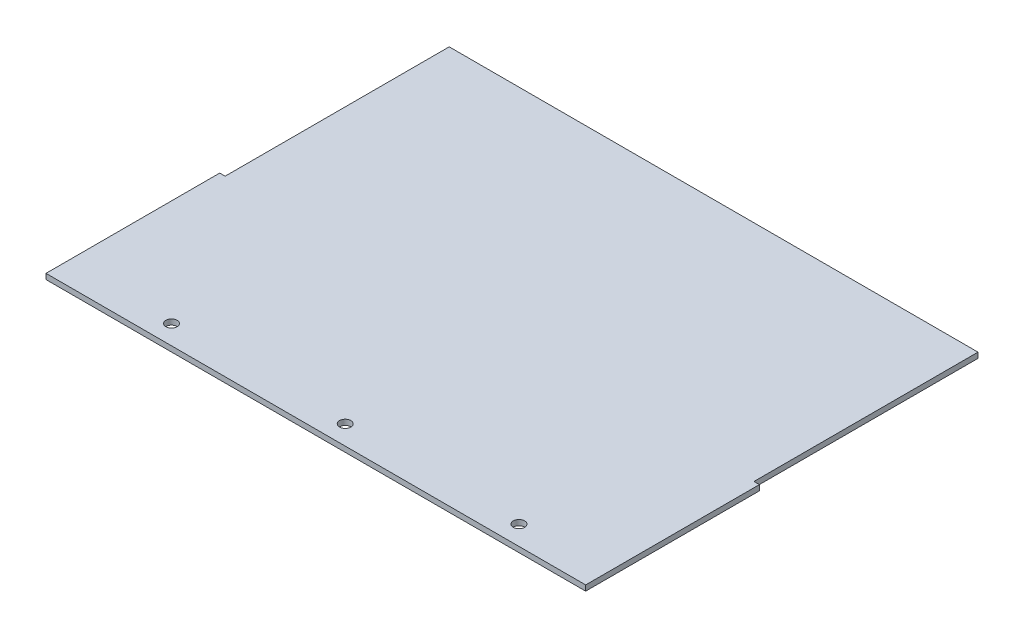
ISO-10303-21;
HEADER;
FILE_DESCRIPTION(('STEP AP214'),'2;1');
FILE_NAME('part.step','',(''),(''),'','','');
FILE_SCHEMA(('AUTOMOTIVE_DESIGN { 1 0 10303 214 1 1 1 1 }'));
ENDSEC;
DATA;
#1=APPLICATION_CONTEXT('core data for automotive mechanical design processes');
#2=APPLICATION_PROTOCOL_DEFINITION('international standard','automotive_design',2000,#1);
#3=PRODUCT_CONTEXT('',#1,'mechanical');
#4=PRODUCT('Part','Part','',(#3));
#5=PRODUCT_RELATED_PRODUCT_CATEGORY('part','',(#4));
#6=PRODUCT_DEFINITION_FORMATION('','',#4);
#7=PRODUCT_DEFINITION_CONTEXT('part definition',#1,'design');
#8=PRODUCT_DEFINITION('design','',#6,#7);
#9=PRODUCT_DEFINITION_SHAPE('','',#8);
#10=(LENGTH_UNIT() NAMED_UNIT(*) SI_UNIT(.MILLI.,.METRE.));
#11=(NAMED_UNIT(*) PLANE_ANGLE_UNIT() SI_UNIT($,.RADIAN.));
#12=(NAMED_UNIT(*) SI_UNIT($,.STERADIAN.) SOLID_ANGLE_UNIT());
#13=UNCERTAINTY_MEASURE_WITH_UNIT(LENGTH_MEASURE(1.E-05),#10,'distance_accuracy_value','');
#14=(GEOMETRIC_REPRESENTATION_CONTEXT(3) GLOBAL_UNCERTAINTY_ASSIGNED_CONTEXT((#13)) GLOBAL_UNIT_ASSIGNED_CONTEXT((#10,
#11,#12)) REPRESENTATION_CONTEXT('',''));
#15=CARTESIAN_POINT('',(0.,0.,0.));
#16=DIRECTION('',(0.,0.,1.));
#17=DIRECTION('',(1.,0.,0.));
#18=AXIS2_PLACEMENT_3D('',#15,#16,#17);
#19=CARTESIAN_POINT('',(-95.7046067812089,1.5875,221.308349999902));
#20=DIRECTION('',(0.,-1.,0.));
#21=DIRECTION('',(0.,0.,-1.));
#22=AXIS2_PLACEMENT_3D('',#19,#20,#21);
#23=CYLINDRICAL_SURFACE('',#22,3.302);
#24=CARTESIAN_POINT('',(-95.7046067812089,1.5875,221.308349999902));
#25=DIRECTION('',(0.,-1.,0.));
#26=DIRECTION('',(0.,0.,-1.));
#27=AXIS2_PLACEMENT_3D('',#24,#25,#26);
#28=CIRCLE('',#27,3.302);
#29=CARTESIAN_POINT('',(-95.7046067812089,1.5875,218.006349999902));
#30=VERTEX_POINT('',#29);
#31=EDGE_CURVE('E47',#30,#30,#28,.T.);
#32=ORIENTED_EDGE('',*,*,#31,.F.);
#33=EDGE_LOOP('',(#32));
#34=FACE_BOUND('',#33,.T.);
#35=CARTESIAN_POINT('',(-95.7046067812089,-1.5875,221.308349999902));
#36=DIRECTION('',(0.,-1.,0.));
#37=DIRECTION('',(0.,0.,-1.));
#38=AXIS2_PLACEMENT_3D('',#35,#36,#37);
#39=CIRCLE('',#38,3.302);
#40=CARTESIAN_POINT('',(-95.7046067812089,-1.5875,218.006349999902));
#41=VERTEX_POINT('',#40);
#42=EDGE_CURVE('E11',#41,#41,#39,.T.);
#43=ORIENTED_EDGE('',*,*,#42,.T.);
#44=EDGE_LOOP('',(#43));
#45=FACE_BOUND('',#44,.T.);
#46=ADVANCED_FACE('F40',(#34,#45),#23,.F.);
#47=CARTESIAN_POINT('',(157.79,-1.5875,232.600000128));
#48=DIRECTION('',(-1.,0.,0.));
#49=DIRECTION('',(0.,0.,1.));
#50=AXIS2_PLACEMENT_3D('',#47,#48,#49);
#51=PLANE('',#50);
#52=DIRECTION('',(0.,1.,0.));
#53=VECTOR('',#52,1.);
#54=CARTESIAN_POINT('',(157.79,-1.5875,130.999992));
#55=LINE('',#54,#53);
#56=CARTESIAN_POINT('',(157.79,-1.5875,130.999992));
#57=VERTEX_POINT('',#56);
#58=CARTESIAN_POINT('',(157.79,1.5875,130.999992));
#59=VERTEX_POINT('',#58);
#60=EDGE_CURVE('E112',#57,#59,#55,.T.);
#61=ORIENTED_EDGE('',*,*,#60,.T.);
#62=DIRECTION('',(0.,0.,-1.));
#63=VECTOR('',#62,1.);
#64=CARTESIAN_POINT('',(157.79,1.5875,232.600000128));
#65=LINE('',#64,#63);
#66=CARTESIAN_POINT('',(157.79,1.5875,232.600000128));
#67=VERTEX_POINT('',#66);
#68=EDGE_CURVE('E176',#67,#59,#65,.T.);
#69=ORIENTED_EDGE('',*,*,#68,.F.);
#70=DIRECTION('',(0.,1.,0.));
#71=VECTOR('',#70,1.);
#72=CARTESIAN_POINT('',(157.79,-1.5875,232.600000128));
#73=LINE('',#72,#71);
#74=CARTESIAN_POINT('',(157.79,-1.5875,232.600000128));
#75=VERTEX_POINT('',#74);
#76=EDGE_CURVE('E157',#75,#67,#73,.T.);
#77=ORIENTED_EDGE('',*,*,#76,.F.);
#78=DIRECTION('',(0.,0.,-1.));
#79=VECTOR('',#78,1.);
#80=CARTESIAN_POINT('',(157.79,-1.5875,232.600000128));
#81=LINE('',#80,#79);
#82=EDGE_CURVE('E166',#75,#57,#81,.T.);
#83=ORIENTED_EDGE('',*,*,#82,.T.);
#84=EDGE_LOOP('',(#61,#69,#77,#83));
#85=FACE_BOUND('',#84,.T.);
#86=ADVANCED_FACE('F185',(#85),#51,.F.);
#87=CARTESIAN_POINT('',(-157.79,1.5875,232.600000128));
#88=DIRECTION('',(0.,-1.,0.));
#89=DIRECTION('',(0.,0.,-1.));
#90=AXIS2_PLACEMENT_3D('',#87,#88,#89);
#91=PLANE('',#90);
#92=CARTESIAN_POINT('',(5.89539321879114,1.5875,221.308349999902));
#93=DIRECTION('',(0.,-1.,0.));
#94=DIRECTION('',(0.,0.,-1.));
#95=AXIS2_PLACEMENT_3D('',#92,#93,#94);
#96=CIRCLE('',#95,3.302);
#97=CARTESIAN_POINT('',(5.89539321879114,1.5875,218.006349999902));
#98=VERTEX_POINT('',#97);
#99=EDGE_CURVE('E326',#98,#98,#96,.T.);
#100=ORIENTED_EDGE('',*,*,#99,.T.);
#101=EDGE_LOOP('',(#100));
#102=FACE_BOUND('',#101,.T.);
#103=CARTESIAN_POINT('',(107.495393218791,1.5875,221.308349999902));
#104=DIRECTION('',(0.,-1.,0.));
#105=DIRECTION('',(0.,0.,-1.));
#106=AXIS2_PLACEMENT_3D('',#103,#104,#105);
#107=CIRCLE('',#106,3.302);
#108=CARTESIAN_POINT('',(107.495393218791,1.5875,218.006349999902));
#109=VERTEX_POINT('',#108);
#110=EDGE_CURVE('E127',#109,#109,#107,.T.);
#111=ORIENTED_EDGE('',*,*,#110,.T.);
#112=EDGE_LOOP('',(#111));
#113=FACE_BOUND('',#112,.T.);
#114=DIRECTION('',(1.,0.,0.));
#115=VECTOR('',#114,1.);
#116=CARTESIAN_POINT('',(-157.79,1.5875,130.999992));
#117=LINE('',#116,#115);
#118=CARTESIAN_POINT('',(154.615,1.5875,130.999992));
#119=VERTEX_POINT('',#118);
#120=EDGE_CURVE('E137',#119,#59,#117,.T.);
#121=ORIENTED_EDGE('',*,*,#120,.F.);
#122=DIRECTION('',(0.,0.,1.));
#123=VECTOR('',#122,1.);
#124=CARTESIAN_POINT('',(154.615,1.5875,232.600000128));
#125=LINE('',#124,#123);
#126=CARTESIAN_POINT('',(154.615,1.5875,0.));
#127=VERTEX_POINT('',#126);
#128=EDGE_CURVE('E119',#127,#119,#125,.T.);
#129=ORIENTED_EDGE('',*,*,#128,.F.);
#130=DIRECTION('',(-1.,0.,0.));
#131=VECTOR('',#130,1.);
#132=CARTESIAN_POINT('',(-157.79,1.5875,0.));
#133=LINE('',#132,#131);
#134=CARTESIAN_POINT('',(-154.615,1.5875,0.));
#135=VERTEX_POINT('',#134);
#136=EDGE_CURVE('E62',#127,#135,#133,.T.);
#137=ORIENTED_EDGE('',*,*,#136,.T.);
#138=DIRECTION('',(0.,0.,1.));
#139=VECTOR('',#138,1.);
#140=CARTESIAN_POINT('',(-154.615,1.5875,232.600000128));
#141=LINE('',#140,#139);
#142=CARTESIAN_POINT('',(-154.615,1.5875,130.999992));
#143=VERTEX_POINT('',#142);
#144=EDGE_CURVE('E148',#135,#143,#141,.T.);
#145=ORIENTED_EDGE('',*,*,#144,.T.);
#146=DIRECTION('',(-1.,0.,0.));
#147=VECTOR('',#146,1.);
#148=CARTESIAN_POINT('',(-157.79,1.5875,130.999992));
#149=LINE('',#148,#147);
#150=CARTESIAN_POINT('',(-157.79,1.5875,130.999992));
#151=VERTEX_POINT('',#150);
#152=EDGE_CURVE('E154',#143,#151,#149,.T.);
#153=ORIENTED_EDGE('',*,*,#152,.T.);
#154=DIRECTION('',(0.,0.,-1.));
#155=VECTOR('',#154,1.);
#156=CARTESIAN_POINT('',(-157.79,1.5875,232.600000128));
#157=LINE('',#156,#155);
#158=CARTESIAN_POINT('',(-157.79,1.5875,232.600000128));
#159=VERTEX_POINT('',#158);
#160=EDGE_CURVE('E173',#159,#151,#157,.T.);
#161=ORIENTED_EDGE('',*,*,#160,.F.);
#162=DIRECTION('',(-1.,0.,0.));
#163=VECTOR('',#162,1.);
#164=CARTESIAN_POINT('',(-157.79,1.5875,232.600000128));
#165=LINE('',#164,#163);
#166=EDGE_CURVE('E160',#67,#159,#165,.T.);
#167=ORIENTED_EDGE('',*,*,#166,.F.);
#168=ORIENTED_EDGE('',*,*,#68,.T.);
#169=EDGE_LOOP('',(#121,#129,#137,#145,#153,#161,#167,#168));
#170=FACE_BOUND('',#169,.T.);
#171=ORIENTED_EDGE('',*,*,#31,.T.);
#172=EDGE_LOOP('',(#171));
#173=FACE_BOUND('',#172,.T.);
#174=ADVANCED_FACE('F181',(#102,#113,#170,#173),#91,.F.);
#175=CARTESIAN_POINT('',(-157.79,-1.5875,232.600000128));
#176=DIRECTION('',(0.,1.,0.));
#177=DIRECTION('',(0.,0.,1.));
#178=AXIS2_PLACEMENT_3D('',#175,#176,#177);
#179=PLANE('',#178);
#180=CARTESIAN_POINT('',(5.89539321879114,-1.5875,221.308349999902));
#181=DIRECTION('',(0.,-1.,0.));
#182=DIRECTION('',(0.,0.,-1.));
#183=AXIS2_PLACEMENT_3D('',#180,#181,#182);
#184=CIRCLE('',#183,3.302);
#185=CARTESIAN_POINT('',(5.89539321879114,-1.5875,218.006349999902));
#186=VERTEX_POINT('',#185);
#187=EDGE_CURVE('E328',#186,#186,#184,.T.);
#188=ORIENTED_EDGE('',*,*,#187,.F.);
#189=EDGE_LOOP('',(#188));
#190=FACE_BOUND('',#189,.T.);
#191=CARTESIAN_POINT('',(107.495393218791,-1.5875,221.308349999902));
#192=DIRECTION('',(0.,-1.,0.));
#193=DIRECTION('',(0.,0.,-1.));
#194=AXIS2_PLACEMENT_3D('',#191,#192,#193);
#195=CIRCLE('',#194,3.302);
#196=CARTESIAN_POINT('',(107.495393218791,-1.5875,218.006349999902));
#197=VERTEX_POINT('',#196);
#198=EDGE_CURVE('E130',#197,#197,#195,.T.);
#199=ORIENTED_EDGE('',*,*,#198,.F.);
#200=EDGE_LOOP('',(#199));
#201=FACE_BOUND('',#200,.T.);
#202=DIRECTION('',(-1.,0.,0.));
#203=VECTOR('',#202,1.);
#204=CARTESIAN_POINT('',(157.79,-1.5875,130.999992));
#205=LINE('',#204,#203);
#206=CARTESIAN_POINT('',(154.615,-1.5875,130.999992));
#207=VERTEX_POINT('',#206);
#208=EDGE_CURVE('E107',#57,#207,#205,.T.);
#209=ORIENTED_EDGE('',*,*,#208,.F.);
#210=ORIENTED_EDGE('',*,*,#82,.F.);
#211=DIRECTION('',(1.,0.,0.));
#212=VECTOR('',#211,1.);
#213=CARTESIAN_POINT('',(-157.79,-1.5875,232.600000128));
#214=LINE('',#213,#212);
#215=CARTESIAN_POINT('',(-157.79,-1.5875,232.600000128));
#216=VERTEX_POINT('',#215);
#217=EDGE_CURVE('E164',#216,#75,#214,.T.);
#218=ORIENTED_EDGE('',*,*,#217,.F.);
#219=DIRECTION('',(0.,0.,-1.));
#220=VECTOR('',#219,1.);
#221=CARTESIAN_POINT('',(-157.79,-1.5875,232.600000128));
#222=LINE('',#221,#220);
#223=CARTESIAN_POINT('',(-157.79,-1.5875,130.999992));
#224=VERTEX_POINT('',#223);
#225=EDGE_CURVE('E170',#216,#224,#222,.T.);
#226=ORIENTED_EDGE('',*,*,#225,.T.);
#227=DIRECTION('',(1.,0.,0.));
#228=VECTOR('',#227,1.);
#229=CARTESIAN_POINT('',(-157.79,-1.5875,130.999992));
#230=LINE('',#229,#228);
#231=CARTESIAN_POINT('',(-154.615,-1.5875,130.999992));
#232=VERTEX_POINT('',#231);
#233=EDGE_CURVE('E139',#224,#232,#230,.T.);
#234=ORIENTED_EDGE('',*,*,#233,.T.);
#235=DIRECTION('',(0.,0.,-1.));
#236=VECTOR('',#235,1.);
#237=CARTESIAN_POINT('',(-154.615,-1.5875,0.));
#238=LINE('',#237,#236);
#239=CARTESIAN_POINT('',(-154.615,-1.5875,0.));
#240=VERTEX_POINT('',#239);
#241=EDGE_CURVE('E142',#232,#240,#238,.T.);
#242=ORIENTED_EDGE('',*,*,#241,.T.);
#243=DIRECTION('',(1.,0.,0.));
#244=VECTOR('',#243,1.);
#245=CARTESIAN_POINT('',(-157.79,-1.5875,0.));
#246=LINE('',#245,#244);
#247=CARTESIAN_POINT('',(154.615,-1.5875,0.));
#248=VERTEX_POINT('',#247);
#249=EDGE_CURVE('E126',#240,#248,#246,.T.);
#250=ORIENTED_EDGE('',*,*,#249,.T.);
#251=DIRECTION('',(0.,0.,-1.));
#252=VECTOR('',#251,1.);
#253=CARTESIAN_POINT('',(154.615,-1.5875,0.));
#254=LINE('',#253,#252);
#255=EDGE_CURVE('E54',#207,#248,#254,.T.);
#256=ORIENTED_EDGE('',*,*,#255,.F.);
#257=EDGE_LOOP('',(#209,#210,#218,#226,#234,#242,#250,#256));
#258=FACE_BOUND('',#257,.T.);
#259=ORIENTED_EDGE('',*,*,#42,.F.);
#260=EDGE_LOOP('',(#259));
#261=FACE_BOUND('',#260,.T.);
#262=ADVANCED_FACE('F122',(#190,#201,#258,#261),#179,.F.);
#263=CARTESIAN_POINT('',(0.,0.,0.));
#264=DIRECTION('',(0.,0.,-1.));
#265=DIRECTION('',(-1.,0.,0.));
#266=AXIS2_PLACEMENT_3D('',#263,#264,#265);
#267=PLANE('',#266);
#268=ORIENTED_EDGE('',*,*,#136,.F.);
#269=DIRECTION('',(0.,1.,0.));
#270=VECTOR('',#269,1.);
#271=CARTESIAN_POINT('',(154.615,-1.5875,0.));
#272=LINE('',#271,#270);
#273=EDGE_CURVE('E116',#248,#127,#272,.T.);
#274=ORIENTED_EDGE('',*,*,#273,.F.);
#275=ORIENTED_EDGE('',*,*,#249,.F.);
#276=DIRECTION('',(0.,1.,0.));
#277=VECTOR('',#276,1.);
#278=CARTESIAN_POINT('',(-154.615,-1.5875,0.));
#279=LINE('',#278,#277);
#280=EDGE_CURVE('E145',#240,#135,#279,.T.);
#281=ORIENTED_EDGE('',*,*,#280,.T.);
#282=EDGE_LOOP('',(#268,#274,#275,#281));
#283=FACE_BOUND('',#282,.T.);
#284=ADVANCED_FACE('F188',(#283),#267,.T.);
#285=CARTESIAN_POINT('',(-157.79,-1.5875,232.600000128));
#286=DIRECTION('',(1.,0.,0.));
#287=DIRECTION('',(0.,0.,-1.));
#288=AXIS2_PLACEMENT_3D('',#285,#286,#287);
#289=PLANE('',#288);
#290=ORIENTED_EDGE('',*,*,#160,.T.);
#291=DIRECTION('',(0.,1.,0.));
#292=VECTOR('',#291,1.);
#293=CARTESIAN_POINT('',(-157.79,-1.5875,130.999992));
#294=LINE('',#293,#292);
#295=EDGE_CURVE('E144',#224,#151,#294,.T.);
#296=ORIENTED_EDGE('',*,*,#295,.F.);
#297=ORIENTED_EDGE('',*,*,#225,.F.);
#298=DIRECTION('',(0.,-1.,0.));
#299=VECTOR('',#298,1.);
#300=CARTESIAN_POINT('',(-157.79,-1.5875,232.600000128));
#301=LINE('',#300,#299);
#302=EDGE_CURVE('E162',#159,#216,#301,.T.);
#303=ORIENTED_EDGE('',*,*,#302,.F.);
#304=EDGE_LOOP('',(#290,#296,#297,#303));
#305=FACE_BOUND('',#304,.T.);
#306=ADVANCED_FACE('F195',(#305),#289,.F.);
#307=CARTESIAN_POINT('',(0.,0.,232.600000128));
#308=DIRECTION('',(0.,0.,-1.));
#309=DIRECTION('',(-1.,0.,0.));
#310=AXIS2_PLACEMENT_3D('',#307,#308,#309);
#311=PLANE('',#310);
#312=ORIENTED_EDGE('',*,*,#76,.T.);
#313=ORIENTED_EDGE('',*,*,#166,.T.);
#314=ORIENTED_EDGE('',*,*,#302,.T.);
#315=ORIENTED_EDGE('',*,*,#217,.T.);
#316=EDGE_LOOP('',(#312,#313,#314,#315));
#317=FACE_BOUND('',#316,.T.);
#318=ADVANCED_FACE('F205',(#317),#311,.F.);
#319=CARTESIAN_POINT('',(-157.79,-1.5875,130.999992));
#320=DIRECTION('',(0.,0.,1.));
#321=DIRECTION('',(1.,0.,0.));
#322=AXIS2_PLACEMENT_3D('',#319,#320,#321);
#323=PLANE('',#322);
#324=DIRECTION('',(0.,1.,0.));
#325=VECTOR('',#324,1.);
#326=CARTESIAN_POINT('',(-154.615,-1.5875,130.999992));
#327=LINE('',#326,#325);
#328=EDGE_CURVE('E149',#232,#143,#327,.T.);
#329=ORIENTED_EDGE('',*,*,#328,.F.);
#330=ORIENTED_EDGE('',*,*,#233,.F.);
#331=ORIENTED_EDGE('',*,*,#295,.T.);
#332=ORIENTED_EDGE('',*,*,#152,.F.);
#333=EDGE_LOOP('',(#329,#330,#331,#332));
#334=FACE_BOUND('',#333,.T.);
#335=ADVANCED_FACE('F220',(#334),#323,.F.);
#336=CARTESIAN_POINT('',(-154.615,-1.5875,0.));
#337=DIRECTION('',(1.,0.,0.));
#338=DIRECTION('',(0.,0.,-1.));
#339=AXIS2_PLACEMENT_3D('',#336,#337,#338);
#340=PLANE('',#339);
#341=ORIENTED_EDGE('',*,*,#280,.F.);
#342=ORIENTED_EDGE('',*,*,#241,.F.);
#343=ORIENTED_EDGE('',*,*,#328,.T.);
#344=ORIENTED_EDGE('',*,*,#144,.F.);
#345=EDGE_LOOP('',(#341,#342,#343,#344));
#346=FACE_BOUND('',#345,.T.);
#347=ADVANCED_FACE('F222',(#346),#340,.F.);
#348=CARTESIAN_POINT('',(157.79,-1.5875,130.999992));
#349=DIRECTION('',(0.,0.,-1.));
#350=DIRECTION('',(-1.,0.,0.));
#351=AXIS2_PLACEMENT_3D('',#348,#349,#350);
#352=PLANE('',#351);
#353=ORIENTED_EDGE('',*,*,#120,.T.);
#354=ORIENTED_EDGE('',*,*,#60,.F.);
#355=ORIENTED_EDGE('',*,*,#208,.T.);
#356=DIRECTION('',(0.,1.,0.));
#357=VECTOR('',#356,1.);
#358=CARTESIAN_POINT('',(154.615,-1.5875,130.999992));
#359=LINE('',#358,#357);
#360=EDGE_CURVE('E109',#207,#119,#359,.T.);
#361=ORIENTED_EDGE('',*,*,#360,.T.);
#362=EDGE_LOOP('',(#353,#354,#355,#361));
#363=FACE_BOUND('',#362,.T.);
#364=ADVANCED_FACE('F108',(#363),#352,.T.);
#365=CARTESIAN_POINT('',(154.615,-1.5875,0.));
#366=DIRECTION('',(1.,0.,0.));
#367=DIRECTION('',(0.,0.,-1.));
#368=AXIS2_PLACEMENT_3D('',#365,#366,#367);
#369=PLANE('',#368);
#370=ORIENTED_EDGE('',*,*,#128,.T.);
#371=ORIENTED_EDGE('',*,*,#360,.F.);
#372=ORIENTED_EDGE('',*,*,#255,.T.);
#373=ORIENTED_EDGE('',*,*,#273,.T.);
#374=EDGE_LOOP('',(#370,#371,#372,#373));
#375=FACE_BOUND('',#374,.T.);
#376=ADVANCED_FACE('F118',(#375),#369,.T.);
#377=CARTESIAN_POINT('',(107.495393218791,1.5875,221.308349999902));
#378=DIRECTION('',(0.,-1.,0.));
#379=DIRECTION('',(0.,0.,-1.));
#380=AXIS2_PLACEMENT_3D('',#377,#378,#379);
#381=CYLINDRICAL_SURFACE('',#380,3.302);
#382=ORIENTED_EDGE('',*,*,#110,.F.);
#383=EDGE_LOOP('',(#382));
#384=FACE_BOUND('',#383,.T.);
#385=ORIENTED_EDGE('',*,*,#198,.T.);
#386=EDGE_LOOP('',(#385));
#387=FACE_BOUND('',#386,.T.);
#388=ADVANCED_FACE('F278',(#384,#387),#381,.F.);
#389=CARTESIAN_POINT('',(5.89539321879114,1.5875,221.308349999902));
#390=DIRECTION('',(0.,-1.,0.));
#391=DIRECTION('',(0.,0.,-1.));
#392=AXIS2_PLACEMENT_3D('',#389,#390,#391);
#393=CYLINDRICAL_SURFACE('',#392,3.302);
#394=ORIENTED_EDGE('',*,*,#99,.F.);
#395=EDGE_LOOP('',(#394));
#396=FACE_BOUND('',#395,.T.);
#397=ORIENTED_EDGE('',*,*,#187,.T.);
#398=EDGE_LOOP('',(#397));
#399=FACE_BOUND('',#398,.T.);
#400=ADVANCED_FACE('F287',(#396,#399),#393,.F.);
#401=CLOSED_SHELL('',(#46,#86,#174,#262,#284,#306,#318,#335,#347,#364,#376,#388,#400));
#402=MANIFOLD_SOLID_BREP('B2',#401);
#403=ADVANCED_BREP_SHAPE_REPRESENTATION('',(#18,#402),#14);
#404=SHAPE_DEFINITION_REPRESENTATION(#9,#403);
ENDSEC;
END-ISO-10303-21;
